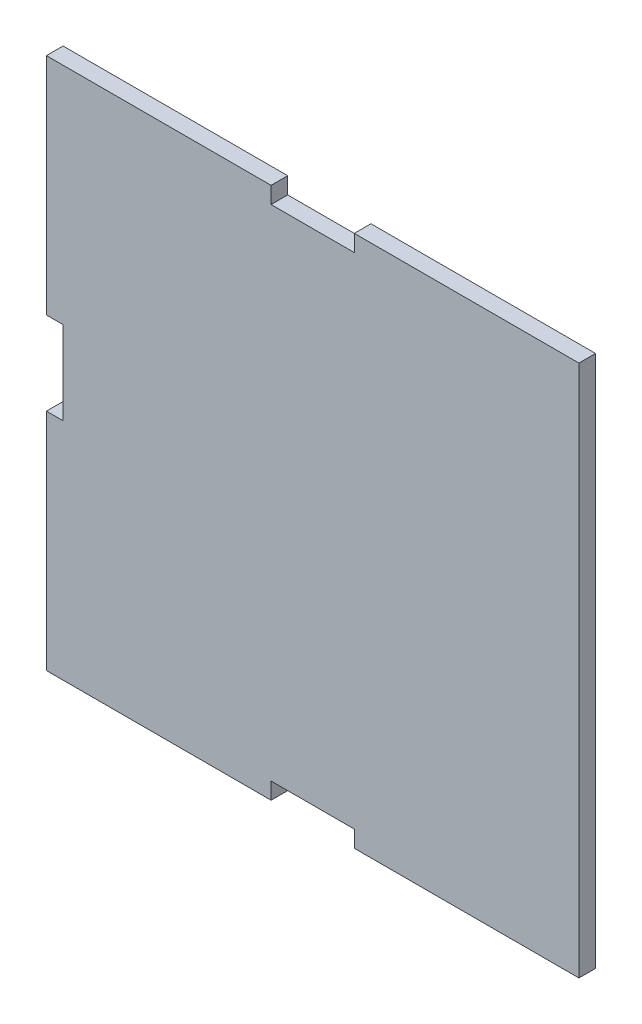
ISO-10303-21;
HEADER;
FILE_DESCRIPTION(('STEP AP214'),'2;1');
FILE_NAME('part.step','',(''),(''),'','','');
FILE_SCHEMA(('AUTOMOTIVE_DESIGN { 1 0 10303 214 1 1 1 1 }'));
ENDSEC;
DATA;
#1=APPLICATION_CONTEXT('core data for automotive mechanical design processes');
#2=APPLICATION_PROTOCOL_DEFINITION('international standard','automotive_design',2000,#1);
#3=PRODUCT_CONTEXT('',#1,'mechanical');
#4=PRODUCT('Part','Part','',(#3));
#5=PRODUCT_RELATED_PRODUCT_CATEGORY('part','',(#4));
#6=PRODUCT_DEFINITION_FORMATION('','',#4);
#7=PRODUCT_DEFINITION_CONTEXT('part definition',#1,'design');
#8=PRODUCT_DEFINITION('design','',#6,#7);
#9=PRODUCT_DEFINITION_SHAPE('','',#8);
#10=(LENGTH_UNIT() NAMED_UNIT(*) SI_UNIT(.MILLI.,.METRE.));
#11=(NAMED_UNIT(*) PLANE_ANGLE_UNIT() SI_UNIT($,.RADIAN.));
#12=(NAMED_UNIT(*) SI_UNIT($,.STERADIAN.) SOLID_ANGLE_UNIT());
#13=UNCERTAINTY_MEASURE_WITH_UNIT(LENGTH_MEASURE(1.E-05),#10,'distance_accuracy_value','');
#14=(GEOMETRIC_REPRESENTATION_CONTEXT(3) GLOBAL_UNCERTAINTY_ASSIGNED_CONTEXT((#13)) GLOBAL_UNIT_ASSIGNED_CONTEXT((#10,
#11,#12)) REPRESENTATION_CONTEXT('',''));
#15=CARTESIAN_POINT('',(0.,0.,0.));
#16=DIRECTION('',(0.,0.,1.));
#17=DIRECTION('',(1.,0.,0.));
#18=AXIS2_PLACEMENT_3D('',#15,#16,#17);
#19=CARTESIAN_POINT('',(16.974358974359,0.,2.));
#20=DIRECTION('',(1.,0.,0.));
#21=DIRECTION('',(0.,0.,-1.));
#22=AXIS2_PLACEMENT_3D('',#19,#20,#21);
#23=PLANE('',#22);
#24=DIRECTION('',(0.,-1.,0.));
#25=VECTOR('',#24,1.);
#26=CARTESIAN_POINT('',(16.974358974359,0.,0.));
#27=LINE('',#26,#25);
#28=CARTESIAN_POINT('',(16.974358974359,42.2051282051282,0.));
#29=VERTEX_POINT('',#28);
#30=CARTESIAN_POINT('',(16.974358974359,-21.7948717948718,0.));
#31=VERTEX_POINT('',#30);
#32=EDGE_CURVE('E181',#29,#31,#27,.T.);
#33=ORIENTED_EDGE('',*,*,#32,.F.);
#34=DIRECTION('',(0.,0.,-1.));
#35=VECTOR('',#34,1.);
#36=CARTESIAN_POINT('',(16.974358974359,42.2051282051282,2.));
#37=LINE('',#36,#35);
#38=CARTESIAN_POINT('',(16.974358974359,42.2051282051282,2.));
#39=VERTEX_POINT('',#38);
#40=EDGE_CURVE('E11',#39,#29,#37,.T.);
#41=ORIENTED_EDGE('',*,*,#40,.F.);
#42=DIRECTION('',(0.,-1.,0.));
#43=VECTOR('',#42,1.);
#44=CARTESIAN_POINT('',(16.974358974359,0.,2.));
#45=LINE('',#44,#43);
#46=CARTESIAN_POINT('',(16.974358974359,-21.7948717948718,2.));
#47=VERTEX_POINT('',#46);
#48=EDGE_CURVE('E216',#39,#47,#45,.T.);
#49=ORIENTED_EDGE('',*,*,#48,.T.);
#50=DIRECTION('',(0.,0.,-1.));
#51=VECTOR('',#50,1.);
#52=CARTESIAN_POINT('',(16.974358974359,-21.7948717948718,2.));
#53=LINE('',#52,#51);
#54=EDGE_CURVE('E55',#47,#31,#53,.T.);
#55=ORIENTED_EDGE('',*,*,#54,.T.);
#56=EDGE_LOOP('',(#33,#41,#49,#55));
#57=FACE_BOUND('',#56,.T.);
#58=ADVANCED_FACE('F39',(#57),#23,.T.);
#59=CARTESIAN_POINT('',(0.,42.2051282051282,2.));
#60=DIRECTION('',(0.,-1.,0.));
#61=DIRECTION('',(0.,0.,-1.));
#62=AXIS2_PLACEMENT_3D('',#59,#60,#61);
#63=PLANE('',#62);
#64=DIRECTION('',(-1.,0.,0.));
#65=VECTOR('',#64,1.);
#66=CARTESIAN_POINT('',(0.,42.2051282051282,0.));
#67=LINE('',#66,#65);
#68=CARTESIAN_POINT('',(-10.025641025641,42.2051282051282,0.));
#69=VERTEX_POINT('',#68);
#70=EDGE_CURVE('E183',#29,#69,#67,.T.);
#71=ORIENTED_EDGE('',*,*,#70,.T.);
#72=DIRECTION('',(0.,0.,-1.));
#73=VECTOR('',#72,1.);
#74=CARTESIAN_POINT('',(-10.025641025641,42.2051282051282,2.));
#75=LINE('',#74,#73);
#76=CARTESIAN_POINT('',(-10.025641025641,42.2051282051282,2.));
#77=VERTEX_POINT('',#76);
#78=EDGE_CURVE('E47',#77,#69,#75,.T.);
#79=ORIENTED_EDGE('',*,*,#78,.F.);
#80=DIRECTION('',(-1.,0.,0.));
#81=VECTOR('',#80,1.);
#82=CARTESIAN_POINT('',(0.,42.2051282051282,2.));
#83=LINE('',#82,#81);
#84=EDGE_CURVE('E481',#39,#77,#83,.T.);
#85=ORIENTED_EDGE('',*,*,#84,.F.);
#86=ORIENTED_EDGE('',*,*,#40,.T.);
#87=EDGE_LOOP('',(#71,#79,#85,#86));
#88=FACE_BOUND('',#87,.T.);
#89=ADVANCED_FACE('F306',(#88),#63,.F.);
#90=CARTESIAN_POINT('',(-10.025641025641,0.,2.));
#91=DIRECTION('',(1.,0.,0.));
#92=DIRECTION('',(0.,0.,-1.));
#93=AXIS2_PLACEMENT_3D('',#90,#91,#92);
#94=PLANE('',#93);
#95=DIRECTION('',(0.,-1.,0.));
#96=VECTOR('',#95,1.);
#97=CARTESIAN_POINT('',(-10.025641025641,0.,0.));
#98=LINE('',#97,#96);
#99=CARTESIAN_POINT('',(-10.025641025641,40.2051282051282,0.));
#100=VERTEX_POINT('',#99);
#101=EDGE_CURVE('E185',#69,#100,#98,.T.);
#102=ORIENTED_EDGE('',*,*,#101,.T.);
#103=DIRECTION('',(0.,0.,-1.));
#104=VECTOR('',#103,1.);
#105=CARTESIAN_POINT('',(-10.025641025641,40.2051282051282,2.));
#106=LINE('',#105,#104);
#107=CARTESIAN_POINT('',(-10.025641025641,40.2051282051282,2.));
#108=VERTEX_POINT('',#107);
#109=EDGE_CURVE('E245',#108,#100,#106,.T.);
#110=ORIENTED_EDGE('',*,*,#109,.F.);
#111=DIRECTION('',(0.,-1.,0.));
#112=VECTOR('',#111,1.);
#113=CARTESIAN_POINT('',(-10.025641025641,0.,2.));
#114=LINE('',#113,#112);
#115=EDGE_CURVE('E254',#77,#108,#114,.T.);
#116=ORIENTED_EDGE('',*,*,#115,.F.);
#117=ORIENTED_EDGE('',*,*,#78,.T.);
#118=EDGE_LOOP('',(#102,#110,#116,#117));
#119=FACE_BOUND('',#118,.T.);
#120=ADVANCED_FACE('F252',(#119),#94,.F.);
#121=CARTESIAN_POINT('',(0.,40.2051282051282,2.));
#122=DIRECTION('',(0.,-1.,0.));
#123=DIRECTION('',(0.,0.,-1.));
#124=AXIS2_PLACEMENT_3D('',#121,#122,#123);
#125=PLANE('',#124);
#126=DIRECTION('',(-1.,0.,0.));
#127=VECTOR('',#126,1.);
#128=CARTESIAN_POINT('',(0.,40.2051282051282,0.));
#129=LINE('',#128,#127);
#130=CARTESIAN_POINT('',(-20.025641025641,40.2051282051282,0.));
#131=VERTEX_POINT('',#130);
#132=EDGE_CURVE('E187',#100,#131,#129,.T.);
#133=ORIENTED_EDGE('',*,*,#132,.T.);
#134=DIRECTION('',(0.,0.,-1.));
#135=VECTOR('',#134,1.);
#136=CARTESIAN_POINT('',(-20.025641025641,40.2051282051282,2.));
#137=LINE('',#136,#135);
#138=CARTESIAN_POINT('',(-20.025641025641,40.2051282051282,2.));
#139=VERTEX_POINT('',#138);
#140=EDGE_CURVE('E242',#139,#131,#137,.T.);
#141=ORIENTED_EDGE('',*,*,#140,.F.);
#142=DIRECTION('',(-1.,0.,0.));
#143=VECTOR('',#142,1.);
#144=CARTESIAN_POINT('',(0.,40.2051282051282,2.));
#145=LINE('',#144,#143);
#146=EDGE_CURVE('E273',#108,#139,#145,.T.);
#147=ORIENTED_EDGE('',*,*,#146,.F.);
#148=ORIENTED_EDGE('',*,*,#109,.T.);
#149=EDGE_LOOP('',(#133,#141,#147,#148));
#150=FACE_BOUND('',#149,.T.);
#151=ADVANCED_FACE('F264',(#150),#125,.F.);
#152=CARTESIAN_POINT('',(-20.025641025641,0.,2.));
#153=DIRECTION('',(-1.,0.,0.));
#154=DIRECTION('',(0.,0.,1.));
#155=AXIS2_PLACEMENT_3D('',#152,#153,#154);
#156=PLANE('',#155);
#157=DIRECTION('',(0.,1.,0.));
#158=VECTOR('',#157,1.);
#159=CARTESIAN_POINT('',(-20.025641025641,0.,0.));
#160=LINE('',#159,#158);
#161=CARTESIAN_POINT('',(-20.025641025641,42.2051282051282,0.));
#162=VERTEX_POINT('',#161);
#163=EDGE_CURVE('E189',#131,#162,#160,.T.);
#164=ORIENTED_EDGE('',*,*,#163,.T.);
#165=DIRECTION('',(0.,0.,-1.));
#166=VECTOR('',#165,1.);
#167=CARTESIAN_POINT('',(-20.025641025641,42.2051282051282,2.));
#168=LINE('',#167,#166);
#169=CARTESIAN_POINT('',(-20.025641025641,42.2051282051282,2.));
#170=VERTEX_POINT('',#169);
#171=EDGE_CURVE('E239',#170,#162,#168,.T.);
#172=ORIENTED_EDGE('',*,*,#171,.F.);
#173=DIRECTION('',(0.,1.,0.));
#174=VECTOR('',#173,1.);
#175=CARTESIAN_POINT('',(-20.025641025641,0.,2.));
#176=LINE('',#175,#174);
#177=EDGE_CURVE('E270',#139,#170,#176,.T.);
#178=ORIENTED_EDGE('',*,*,#177,.F.);
#179=ORIENTED_EDGE('',*,*,#140,.T.);
#180=EDGE_LOOP('',(#164,#172,#178,#179));
#181=FACE_BOUND('',#180,.T.);
#182=ADVANCED_FACE('F268',(#181),#156,.F.);
#183=CARTESIAN_POINT('',(0.,42.2051282051282,2.));
#184=DIRECTION('',(0.,-1.,0.));
#185=DIRECTION('',(1.,0.,0.));
#186=AXIS2_PLACEMENT_3D('',#183,#184,#185);
#187=PLANE('',#186);
#188=DIRECTION('',(-1.,0.,0.));
#189=VECTOR('',#188,1.);
#190=CARTESIAN_POINT('',(0.,42.2051282051282,0.));
#191=LINE('',#190,#189);
#192=CARTESIAN_POINT('',(-47.025641025641,42.2051282051282,0.));
#193=VERTEX_POINT('',#192);
#194=EDGE_CURVE('E191',#162,#193,#191,.T.);
#195=ORIENTED_EDGE('',*,*,#194,.T.);
#196=DIRECTION('',(0.,0.,-1.));
#197=VECTOR('',#196,1.);
#198=CARTESIAN_POINT('',(-47.025641025641,42.2051282051282,2.));
#199=LINE('',#198,#197);
#200=CARTESIAN_POINT('',(-47.025641025641,42.2051282051282,2.));
#201=VERTEX_POINT('',#200);
#202=EDGE_CURVE('E236',#201,#193,#199,.T.);
#203=ORIENTED_EDGE('',*,*,#202,.F.);
#204=DIRECTION('',(-1.,0.,0.));
#205=VECTOR('',#204,1.);
#206=CARTESIAN_POINT('',(0.,42.2051282051282,2.));
#207=LINE('',#206,#205);
#208=EDGE_CURVE('E272',#170,#201,#207,.T.);
#209=ORIENTED_EDGE('',*,*,#208,.F.);
#210=ORIENTED_EDGE('',*,*,#171,.T.);
#211=EDGE_LOOP('',(#195,#203,#209,#210));
#212=FACE_BOUND('',#211,.T.);
#213=ADVANCED_FACE('F319',(#212),#187,.F.);
#214=CARTESIAN_POINT('',(-47.025641025641,0.,2.));
#215=DIRECTION('',(1.,0.,0.));
#216=DIRECTION('',(0.,1.,0.));
#217=AXIS2_PLACEMENT_3D('',#214,#215,#216);
#218=PLANE('',#217);
#219=DIRECTION('',(0.,-1.,0.));
#220=VECTOR('',#219,1.);
#221=CARTESIAN_POINT('',(-47.025641025641,0.,0.));
#222=LINE('',#221,#220);
#223=CARTESIAN_POINT('',(-47.025641025641,15.2051282051282,0.));
#224=VERTEX_POINT('',#223);
#225=EDGE_CURVE('E193',#193,#224,#222,.T.);
#226=ORIENTED_EDGE('',*,*,#225,.T.);
#227=DIRECTION('',(0.,0.,-1.));
#228=VECTOR('',#227,1.);
#229=CARTESIAN_POINT('',(-47.025641025641,15.2051282051282,2.));
#230=LINE('',#229,#228);
#231=CARTESIAN_POINT('',(-47.025641025641,15.2051282051282,2.));
#232=VERTEX_POINT('',#231);
#233=EDGE_CURVE('E233',#232,#224,#230,.T.);
#234=ORIENTED_EDGE('',*,*,#233,.F.);
#235=DIRECTION('',(0.,-1.,0.));
#236=VECTOR('',#235,1.);
#237=CARTESIAN_POINT('',(-47.025641025641,0.,2.));
#238=LINE('',#237,#236);
#239=EDGE_CURVE('E275',#201,#232,#238,.T.);
#240=ORIENTED_EDGE('',*,*,#239,.F.);
#241=ORIENTED_EDGE('',*,*,#202,.T.);
#242=EDGE_LOOP('',(#226,#234,#240,#241));
#243=FACE_BOUND('',#242,.T.);
#244=ADVANCED_FACE('F322',(#243),#218,.F.);
#245=CARTESIAN_POINT('',(0.,15.2051282051282,2.));
#246=DIRECTION('',(0.,1.,0.));
#247=DIRECTION('',(0.,0.,1.));
#248=AXIS2_PLACEMENT_3D('',#245,#246,#247);
#249=PLANE('',#248);
#250=DIRECTION('',(1.,0.,0.));
#251=VECTOR('',#250,1.);
#252=CARTESIAN_POINT('',(0.,15.2051282051282,0.));
#253=LINE('',#252,#251);
#254=CARTESIAN_POINT('',(-45.025641025641,15.2051282051282,0.));
#255=VERTEX_POINT('',#254);
#256=EDGE_CURVE('E195',#224,#255,#253,.T.);
#257=ORIENTED_EDGE('',*,*,#256,.T.);
#258=DIRECTION('',(0.,0.,-1.));
#259=VECTOR('',#258,1.);
#260=CARTESIAN_POINT('',(-45.025641025641,15.2051282051282,2.));
#261=LINE('',#260,#259);
#262=CARTESIAN_POINT('',(-45.025641025641,15.2051282051282,2.));
#263=VERTEX_POINT('',#262);
#264=EDGE_CURVE('E230',#263,#255,#261,.T.);
#265=ORIENTED_EDGE('',*,*,#264,.F.);
#266=DIRECTION('',(1.,0.,0.));
#267=VECTOR('',#266,1.);
#268=CARTESIAN_POINT('',(0.,15.2051282051282,2.));
#269=LINE('',#268,#267);
#270=EDGE_CURVE('E281',#232,#263,#269,.T.);
#271=ORIENTED_EDGE('',*,*,#270,.F.);
#272=ORIENTED_EDGE('',*,*,#233,.T.);
#273=EDGE_LOOP('',(#257,#265,#271,#272));
#274=FACE_BOUND('',#273,.T.);
#275=ADVANCED_FACE('F326',(#274),#249,.F.);
#276=CARTESIAN_POINT('',(-45.025641025641,0.,2.));
#277=DIRECTION('',(1.,0.,0.));
#278=DIRECTION('',(0.,0.,-1.));
#279=AXIS2_PLACEMENT_3D('',#276,#277,#278);
#280=PLANE('',#279);
#281=DIRECTION('',(0.,-1.,0.));
#282=VECTOR('',#281,1.);
#283=CARTESIAN_POINT('',(-45.025641025641,0.,0.));
#284=LINE('',#283,#282);
#285=CARTESIAN_POINT('',(-45.025641025641,5.2051282051282,0.));
#286=VERTEX_POINT('',#285);
#287=EDGE_CURVE('E197',#255,#286,#284,.T.);
#288=ORIENTED_EDGE('',*,*,#287,.T.);
#289=DIRECTION('',(0.,0.,-1.));
#290=VECTOR('',#289,1.);
#291=CARTESIAN_POINT('',(-45.025641025641,5.2051282051282,2.));
#292=LINE('',#291,#290);
#293=CARTESIAN_POINT('',(-45.025641025641,5.2051282051282,2.));
#294=VERTEX_POINT('',#293);
#295=EDGE_CURVE('E227',#294,#286,#292,.T.);
#296=ORIENTED_EDGE('',*,*,#295,.F.);
#297=DIRECTION('',(0.,-1.,0.));
#298=VECTOR('',#297,1.);
#299=CARTESIAN_POINT('',(-45.025641025641,0.,2.));
#300=LINE('',#299,#298);
#301=EDGE_CURVE('E283',#263,#294,#300,.T.);
#302=ORIENTED_EDGE('',*,*,#301,.F.);
#303=ORIENTED_EDGE('',*,*,#264,.T.);
#304=EDGE_LOOP('',(#288,#296,#302,#303));
#305=FACE_BOUND('',#304,.T.);
#306=ADVANCED_FACE('F330',(#305),#280,.F.);
#307=CARTESIAN_POINT('',(0.,5.20512820512822,2.));
#308=DIRECTION('',(0.,-1.,0.));
#309=DIRECTION('',(1.,0.,0.));
#310=AXIS2_PLACEMENT_3D('',#307,#308,#309);
#311=PLANE('',#310);
#312=DIRECTION('',(-1.,0.,0.));
#313=VECTOR('',#312,1.);
#314=CARTESIAN_POINT('',(0.,5.20512820512822,0.));
#315=LINE('',#314,#313);
#316=CARTESIAN_POINT('',(-47.025641025641,5.2051282051282,0.));
#317=VERTEX_POINT('',#316);
#318=EDGE_CURVE('E199',#286,#317,#315,.T.);
#319=ORIENTED_EDGE('',*,*,#318,.T.);
#320=DIRECTION('',(0.,0.,-1.));
#321=VECTOR('',#320,1.);
#322=CARTESIAN_POINT('',(-47.025641025641,5.2051282051282,2.));
#323=LINE('',#322,#321);
#324=CARTESIAN_POINT('',(-47.025641025641,5.2051282051282,2.));
#325=VERTEX_POINT('',#324);
#326=EDGE_CURVE('E224',#325,#317,#323,.T.);
#327=ORIENTED_EDGE('',*,*,#326,.F.);
#328=DIRECTION('',(-1.,0.,0.));
#329=VECTOR('',#328,1.);
#330=CARTESIAN_POINT('',(0.,5.20512820512822,2.));
#331=LINE('',#330,#329);
#332=EDGE_CURVE('E285',#294,#325,#331,.T.);
#333=ORIENTED_EDGE('',*,*,#332,.F.);
#334=ORIENTED_EDGE('',*,*,#295,.T.);
#335=EDGE_LOOP('',(#319,#327,#333,#334));
#336=FACE_BOUND('',#335,.T.);
#337=ADVANCED_FACE('F334',(#336),#311,.F.);
#338=CARTESIAN_POINT('',(-47.025641025641,0.,2.));
#339=DIRECTION('',(1.,0.,0.));
#340=DIRECTION('',(0.,0.,-1.));
#341=AXIS2_PLACEMENT_3D('',#338,#339,#340);
#342=PLANE('',#341);
#343=DIRECTION('',(0.,-1.,0.));
#344=VECTOR('',#343,1.);
#345=CARTESIAN_POINT('',(-47.025641025641,0.,0.));
#346=LINE('',#345,#344);
#347=CARTESIAN_POINT('',(-47.025641025641,-21.7948717948718,0.));
#348=VERTEX_POINT('',#347);
#349=EDGE_CURVE('E201',#317,#348,#346,.T.);
#350=ORIENTED_EDGE('',*,*,#349,.T.);
#351=DIRECTION('',(0.,0.,-1.));
#352=VECTOR('',#351,1.);
#353=CARTESIAN_POINT('',(-47.025641025641,-21.7948717948718,2.));
#354=LINE('',#353,#352);
#355=CARTESIAN_POINT('',(-47.025641025641,-21.7948717948718,2.));
#356=VERTEX_POINT('',#355);
#357=EDGE_CURVE('E222',#356,#348,#354,.T.);
#358=ORIENTED_EDGE('',*,*,#357,.F.);
#359=DIRECTION('',(0.,-1.,0.));
#360=VECTOR('',#359,1.);
#361=CARTESIAN_POINT('',(-47.025641025641,0.,2.));
#362=LINE('',#361,#360);
#363=EDGE_CURVE('E287',#325,#356,#362,.T.);
#364=ORIENTED_EDGE('',*,*,#363,.F.);
#365=ORIENTED_EDGE('',*,*,#326,.T.);
#366=EDGE_LOOP('',(#350,#358,#364,#365));
#367=FACE_BOUND('',#366,.T.);
#368=ADVANCED_FACE('F338',(#367),#342,.F.);
#369=CARTESIAN_POINT('',(0.,-21.7948717948718,2.));
#370=DIRECTION('',(0.,-1.,0.));
#371=DIRECTION('',(0.,0.,-1.));
#372=AXIS2_PLACEMENT_3D('',#369,#370,#371);
#373=PLANE('',#372);
#374=DIRECTION('',(-1.,0.,0.));
#375=VECTOR('',#374,1.);
#376=CARTESIAN_POINT('',(0.,-21.7948717948718,0.));
#377=LINE('',#376,#375);
#378=CARTESIAN_POINT('',(-20.025641025641,-21.7948717948718,0.));
#379=VERTEX_POINT('',#378);
#380=EDGE_CURVE('E204',#379,#348,#377,.T.);
#381=ORIENTED_EDGE('',*,*,#380,.F.);
#382=DIRECTION('',(0.,0.,-1.));
#383=VECTOR('',#382,1.);
#384=CARTESIAN_POINT('',(-20.025641025641,-21.7948717948718,2.));
#385=LINE('',#384,#383);
#386=CARTESIAN_POINT('',(-20.025641025641,-21.7948717948718,2.));
#387=VERTEX_POINT('',#386);
#388=EDGE_CURVE('E220',#387,#379,#385,.T.);
#389=ORIENTED_EDGE('',*,*,#388,.F.);
#390=DIRECTION('',(-1.,0.,0.));
#391=VECTOR('',#390,1.);
#392=CARTESIAN_POINT('',(0.,-21.7948717948718,2.));
#393=LINE('',#392,#391);
#394=EDGE_CURVE('E289',#387,#356,#393,.T.);
#395=ORIENTED_EDGE('',*,*,#394,.T.);
#396=ORIENTED_EDGE('',*,*,#357,.T.);
#397=EDGE_LOOP('',(#381,#389,#395,#396));
#398=FACE_BOUND('',#397,.T.);
#399=ADVANCED_FACE('F342',(#398),#373,.T.);
#400=CARTESIAN_POINT('',(-20.025641025641,0.,2.));
#401=DIRECTION('',(1.,0.,0.));
#402=DIRECTION('',(0.,0.,-1.));
#403=AXIS2_PLACEMENT_3D('',#400,#401,#402);
#404=PLANE('',#403);
#405=DIRECTION('',(0.,-1.,0.));
#406=VECTOR('',#405,1.);
#407=CARTESIAN_POINT('',(-20.025641025641,0.,0.));
#408=LINE('',#407,#406);
#409=CARTESIAN_POINT('',(-20.025641025641,-19.7948717948718,0.));
#410=VERTEX_POINT('',#409);
#411=EDGE_CURVE('E207',#410,#379,#408,.T.);
#412=ORIENTED_EDGE('',*,*,#411,.F.);
#413=DIRECTION('',(0.,0.,-1.));
#414=VECTOR('',#413,1.);
#415=CARTESIAN_POINT('',(-20.025641025641,-19.7948717948718,2.));
#416=LINE('',#415,#414);
#417=CARTESIAN_POINT('',(-20.025641025641,-19.7948717948718,2.));
#418=VERTEX_POINT('',#417);
#419=EDGE_CURVE('E162',#418,#410,#416,.T.);
#420=ORIENTED_EDGE('',*,*,#419,.F.);
#421=DIRECTION('',(0.,-1.,0.));
#422=VECTOR('',#421,1.);
#423=CARTESIAN_POINT('',(-20.025641025641,0.,2.));
#424=LINE('',#423,#422);
#425=EDGE_CURVE('E173',#418,#387,#424,.T.);
#426=ORIENTED_EDGE('',*,*,#425,.T.);
#427=ORIENTED_EDGE('',*,*,#388,.T.);
#428=EDGE_LOOP('',(#412,#420,#426,#427));
#429=FACE_BOUND('',#428,.T.);
#430=ADVANCED_FACE('F293',(#429),#404,.T.);
#431=CARTESIAN_POINT('',(0.,-19.7948717948718,2.));
#432=DIRECTION('',(0.,-1.,0.));
#433=DIRECTION('',(0.,0.,-1.));
#434=AXIS2_PLACEMENT_3D('',#431,#432,#433);
#435=PLANE('',#434);
#436=DIRECTION('',(-1.,0.,0.));
#437=VECTOR('',#436,1.);
#438=CARTESIAN_POINT('',(0.,-19.7948717948718,0.));
#439=LINE('',#438,#437);
#440=CARTESIAN_POINT('',(-10.025641025641,-19.7948717948718,0.));
#441=VERTEX_POINT('',#440);
#442=EDGE_CURVE('E158',#441,#410,#439,.T.);
#443=ORIENTED_EDGE('',*,*,#442,.F.);
#444=DIRECTION('',(0.,0.,-1.));
#445=VECTOR('',#444,1.);
#446=CARTESIAN_POINT('',(-10.025641025641,-19.7948717948718,2.));
#447=LINE('',#446,#445);
#448=CARTESIAN_POINT('',(-10.025641025641,-19.7948717948718,2.));
#449=VERTEX_POINT('',#448);
#450=EDGE_CURVE('E153',#449,#441,#447,.T.);
#451=ORIENTED_EDGE('',*,*,#450,.F.);
#452=DIRECTION('',(-1.,0.,0.));
#453=VECTOR('',#452,1.);
#454=CARTESIAN_POINT('',(0.,-19.7948717948718,2.));
#455=LINE('',#454,#453);
#456=EDGE_CURVE('E156',#449,#418,#455,.T.);
#457=ORIENTED_EDGE('',*,*,#456,.T.);
#458=ORIENTED_EDGE('',*,*,#419,.T.);
#459=EDGE_LOOP('',(#443,#451,#457,#458));
#460=FACE_BOUND('',#459,.T.);
#461=ADVANCED_FACE('F155',(#460),#435,.T.);
#462=CARTESIAN_POINT('',(-10.025641025641,0.,2.));
#463=DIRECTION('',(-1.,0.,0.));
#464=DIRECTION('',(0.,0.,1.));
#465=AXIS2_PLACEMENT_3D('',#462,#463,#464);
#466=PLANE('',#465);
#467=DIRECTION('',(0.,1.,0.));
#468=VECTOR('',#467,1.);
#469=CARTESIAN_POINT('',(-10.025641025641,0.,0.));
#470=LINE('',#469,#468);
#471=CARTESIAN_POINT('',(-10.025641025641,-21.7948717948718,0.));
#472=VERTEX_POINT('',#471);
#473=EDGE_CURVE('E211',#472,#441,#470,.T.);
#474=ORIENTED_EDGE('',*,*,#473,.F.);
#475=DIRECTION('',(0.,0.,-1.));
#476=VECTOR('',#475,1.);
#477=CARTESIAN_POINT('',(-10.025641025641,-21.7948717948718,2.));
#478=LINE('',#477,#476);
#479=CARTESIAN_POINT('',(-10.025641025641,-21.7948717948718,2.));
#480=VERTEX_POINT('',#479);
#481=EDGE_CURVE('E104',#480,#472,#478,.T.);
#482=ORIENTED_EDGE('',*,*,#481,.F.);
#483=DIRECTION('',(0.,1.,0.));
#484=VECTOR('',#483,1.);
#485=CARTESIAN_POINT('',(-10.025641025641,0.,2.));
#486=LINE('',#485,#484);
#487=EDGE_CURVE('E170',#480,#449,#486,.T.);
#488=ORIENTED_EDGE('',*,*,#487,.T.);
#489=ORIENTED_EDGE('',*,*,#450,.T.);
#490=EDGE_LOOP('',(#474,#482,#488,#489));
#491=FACE_BOUND('',#490,.T.);
#492=ADVANCED_FACE('F175',(#491),#466,.T.);
#493=CARTESIAN_POINT('',(0.,-21.7948717948718,2.));
#494=DIRECTION('',(0.,-1.,0.));
#495=DIRECTION('',(0.,0.,-1.));
#496=AXIS2_PLACEMENT_3D('',#493,#494,#495);
#497=PLANE('',#496);
#498=DIRECTION('',(-1.,0.,0.));
#499=VECTOR('',#498,1.);
#500=CARTESIAN_POINT('',(0.,-21.7948717948718,0.));
#501=LINE('',#500,#499);
#502=EDGE_CURVE('E213',#31,#472,#501,.T.);
#503=ORIENTED_EDGE('',*,*,#502,.F.);
#504=ORIENTED_EDGE('',*,*,#54,.F.);
#505=DIRECTION('',(-1.,0.,0.));
#506=VECTOR('',#505,1.);
#507=CARTESIAN_POINT('',(0.,-21.7948717948718,2.));
#508=LINE('',#507,#506);
#509=EDGE_CURVE('E176',#47,#480,#508,.T.);
#510=ORIENTED_EDGE('',*,*,#509,.T.);
#511=ORIENTED_EDGE('',*,*,#481,.T.);
#512=EDGE_LOOP('',(#503,#504,#510,#511));
#513=FACE_BOUND('',#512,.T.);
#514=ADVANCED_FACE('F295',(#513),#497,.T.);
#515=CARTESIAN_POINT('',(0.,0.,2.));
#516=DIRECTION('',(0.,0.,1.));
#517=DIRECTION('',(1.,0.,0.));
#518=AXIS2_PLACEMENT_3D('',#515,#516,#517);
#519=PLANE('',#518);
#520=ORIENTED_EDGE('',*,*,#48,.F.);
#521=ORIENTED_EDGE('',*,*,#84,.T.);
#522=ORIENTED_EDGE('',*,*,#115,.T.);
#523=ORIENTED_EDGE('',*,*,#146,.T.);
#524=ORIENTED_EDGE('',*,*,#177,.T.);
#525=ORIENTED_EDGE('',*,*,#208,.T.);
#526=ORIENTED_EDGE('',*,*,#239,.T.);
#527=ORIENTED_EDGE('',*,*,#270,.T.);
#528=ORIENTED_EDGE('',*,*,#301,.T.);
#529=ORIENTED_EDGE('',*,*,#332,.T.);
#530=ORIENTED_EDGE('',*,*,#363,.T.);
#531=ORIENTED_EDGE('',*,*,#394,.F.);
#532=ORIENTED_EDGE('',*,*,#425,.F.);
#533=ORIENTED_EDGE('',*,*,#456,.F.);
#534=ORIENTED_EDGE('',*,*,#487,.F.);
#535=ORIENTED_EDGE('',*,*,#509,.F.);
#536=EDGE_LOOP('',(#520,#521,#522,#523,#524,#525,#526,#527,#528,#529,#530,#531,#532,#533,#534,#535));
#537=FACE_BOUND('',#536,.T.);
#538=ADVANCED_FACE('F168',(#537),#519,.T.);
#539=CARTESIAN_POINT('',(0.,0.,0.));
#540=DIRECTION('',(0.,0.,1.));
#541=DIRECTION('',(1.,0.,0.));
#542=AXIS2_PLACEMENT_3D('',#539,#540,#541);
#543=PLANE('',#542);
#544=ORIENTED_EDGE('',*,*,#32,.T.);
#545=ORIENTED_EDGE('',*,*,#502,.T.);
#546=ORIENTED_EDGE('',*,*,#473,.T.);
#547=ORIENTED_EDGE('',*,*,#442,.T.);
#548=ORIENTED_EDGE('',*,*,#411,.T.);
#549=ORIENTED_EDGE('',*,*,#380,.T.);
#550=ORIENTED_EDGE('',*,*,#349,.F.);
#551=ORIENTED_EDGE('',*,*,#318,.F.);
#552=ORIENTED_EDGE('',*,*,#287,.F.);
#553=ORIENTED_EDGE('',*,*,#256,.F.);
#554=ORIENTED_EDGE('',*,*,#225,.F.);
#555=ORIENTED_EDGE('',*,*,#194,.F.);
#556=ORIENTED_EDGE('',*,*,#163,.F.);
#557=ORIENTED_EDGE('',*,*,#132,.F.);
#558=ORIENTED_EDGE('',*,*,#101,.F.);
#559=ORIENTED_EDGE('',*,*,#70,.F.);
#560=EDGE_LOOP('',(#544,#545,#546,#547,#548,#549,#550,#551,#552,#553,#554,#555,#556,#557,#558,#559));
#561=FACE_BOUND('',#560,.T.);
#562=ADVANCED_FACE('F259',(#561),#543,.F.);
#563=CLOSED_SHELL('',(#58,#89,#120,#151,#182,#213,#244,#275,#306,#337,#368,#399,#430,#461,#492,
#514,#538,#562));
#564=MANIFOLD_SOLID_BREP('B2',#563);
#565=ADVANCED_BREP_SHAPE_REPRESENTATION('',(#18,#564),#14);
#566=SHAPE_DEFINITION_REPRESENTATION(#9,#565);
ENDSEC;
END-ISO-10303-21;
